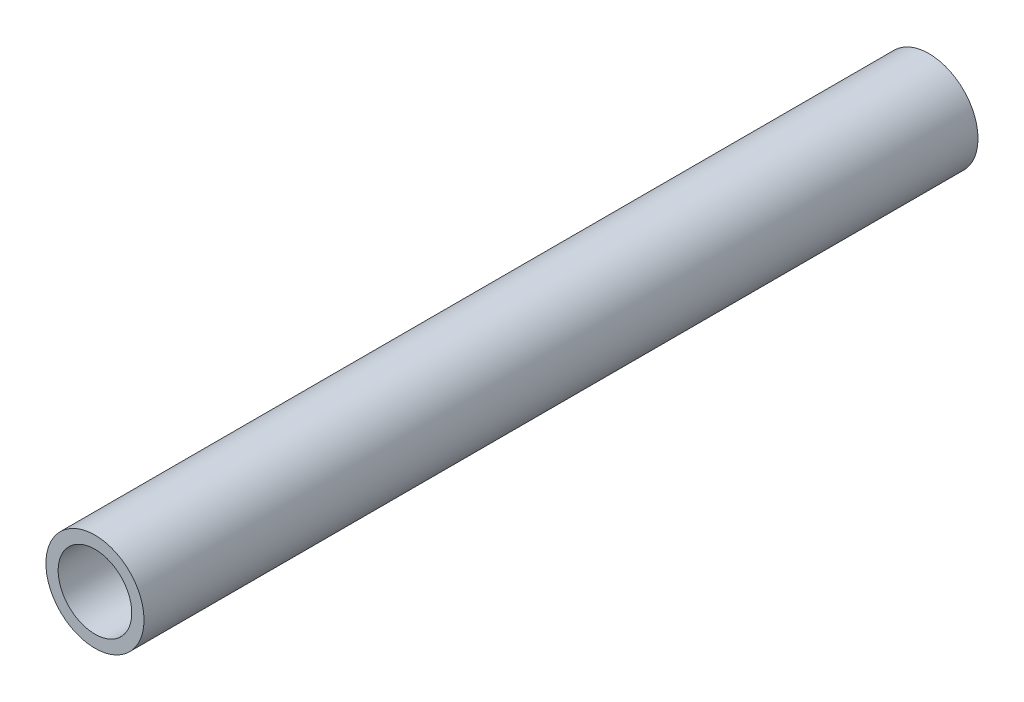
ISO-10303-21;
HEADER;
FILE_DESCRIPTION(('STEP AP214'),'2;1');
FILE_NAME('part.step','',(''),(''),'','','');
FILE_SCHEMA(('AUTOMOTIVE_DESIGN { 1 0 10303 214 1 1 1 1 }'));
ENDSEC;
DATA;
#1=APPLICATION_CONTEXT('core data for automotive mechanical design processes');
#2=APPLICATION_PROTOCOL_DEFINITION('international standard','automotive_design',2000,#1);
#3=PRODUCT_CONTEXT('',#1,'mechanical');
#4=PRODUCT('Part','Part','',(#3));
#5=PRODUCT_RELATED_PRODUCT_CATEGORY('part','',(#4));
#6=PRODUCT_DEFINITION_FORMATION('','',#4);
#7=PRODUCT_DEFINITION_CONTEXT('part definition',#1,'design');
#8=PRODUCT_DEFINITION('design','',#6,#7);
#9=PRODUCT_DEFINITION_SHAPE('','',#8);
#10=(LENGTH_UNIT() NAMED_UNIT(*) SI_UNIT(.MILLI.,.METRE.));
#11=(NAMED_UNIT(*) PLANE_ANGLE_UNIT() SI_UNIT($,.RADIAN.));
#12=(NAMED_UNIT(*) SI_UNIT($,.STERADIAN.) SOLID_ANGLE_UNIT());
#13=UNCERTAINTY_MEASURE_WITH_UNIT(LENGTH_MEASURE(1.E-05),#10,'distance_accuracy_value','');
#14=(GEOMETRIC_REPRESENTATION_CONTEXT(3) GLOBAL_UNCERTAINTY_ASSIGNED_CONTEXT((#13)) GLOBAL_UNIT_ASSIGNED_CONTEXT((#10,
#11,#12)) REPRESENTATION_CONTEXT('',''));
#15=CARTESIAN_POINT('',(0.,0.,0.));
#16=DIRECTION('',(0.,0.,1.));
#17=DIRECTION('',(1.,0.,0.));
#18=AXIS2_PLACEMENT_3D('',#15,#16,#17);
#19=CARTESIAN_POINT('',(0.,0.,215.9));
#20=DIRECTION('',(0.,0.,1.));
#21=DIRECTION('',(1.,0.,0.));
#22=AXIS2_PLACEMENT_3D('',#19,#20,#21);
#23=PLANE('',#22);
#24=CARTESIAN_POINT('',(0.,0.,215.9));
#25=DIRECTION('',(0.,0.,1.));
#26=DIRECTION('',(1.,0.,0.));
#27=AXIS2_PLACEMENT_3D('',#24,#25,#26);
#28=CIRCLE('',#27,12.7);
#29=CARTESIAN_POINT('',(12.7,0.,215.9));
#30=VERTEX_POINT('',#29);
#31=EDGE_CURVE('E10',#30,#30,#28,.T.);
#32=ORIENTED_EDGE('',*,*,#31,.T.);
#33=EDGE_LOOP('',(#32));
#34=FACE_BOUND('',#33,.T.);
#35=CARTESIAN_POINT('',(0.,0.,215.9));
#36=DIRECTION('',(0.,0.,1.));
#37=DIRECTION('',(1.,0.,0.));
#38=AXIS2_PLACEMENT_3D('',#35,#36,#37);
#39=CIRCLE('',#38,9.525);
#40=CARTESIAN_POINT('',(9.525,0.,215.9));
#41=VERTEX_POINT('',#40);
#42=EDGE_CURVE('E44',#41,#41,#39,.T.);
#43=ORIENTED_EDGE('',*,*,#42,.F.);
#44=EDGE_LOOP('',(#43));
#45=FACE_BOUND('',#44,.T.);
#46=ADVANCED_FACE('F33',(#34,#45),#23,.T.);
#47=CARTESIAN_POINT('',(0.,0.,0.));
#48=DIRECTION('',(0.,0.,1.));
#49=DIRECTION('',(1.,0.,0.));
#50=AXIS2_PLACEMENT_3D('',#47,#48,#49);
#51=PLANE('',#50);
#52=CARTESIAN_POINT('',(0.,0.,0.));
#53=DIRECTION('',(0.,0.,1.));
#54=DIRECTION('',(1.,0.,0.));
#55=AXIS2_PLACEMENT_3D('',#52,#53,#54);
#56=CIRCLE('',#55,12.7);
#57=CARTESIAN_POINT('',(12.7,0.,0.));
#58=VERTEX_POINT('',#57);
#59=EDGE_CURVE('E37',#58,#58,#56,.T.);
#60=ORIENTED_EDGE('',*,*,#59,.F.);
#61=EDGE_LOOP('',(#60));
#62=FACE_BOUND('',#61,.T.);
#63=CARTESIAN_POINT('',(0.,0.,0.));
#64=DIRECTION('',(0.,0.,1.));
#65=DIRECTION('',(1.,0.,0.));
#66=AXIS2_PLACEMENT_3D('',#63,#64,#65);
#67=CIRCLE('',#66,9.525);
#68=CARTESIAN_POINT('',(9.525,0.,0.));
#69=VERTEX_POINT('',#68);
#70=EDGE_CURVE('E46',#69,#69,#67,.T.);
#71=ORIENTED_EDGE('',*,*,#70,.T.);
#72=EDGE_LOOP('',(#71));
#73=FACE_BOUND('',#72,.T.);
#74=ADVANCED_FACE('F56',(#62,#73),#51,.F.);
#75=CARTESIAN_POINT('',(0.,0.,215.9));
#76=DIRECTION('',(0.,0.,-1.));
#77=DIRECTION('',(-1.,0.,0.));
#78=AXIS2_PLACEMENT_3D('',#75,#76,#77);
#79=CYLINDRICAL_SURFACE('',#78,12.7);
#80=ORIENTED_EDGE('',*,*,#31,.F.);
#81=EDGE_LOOP('',(#80));
#82=FACE_BOUND('',#81,.T.);
#83=ORIENTED_EDGE('',*,*,#59,.T.);
#84=EDGE_LOOP('',(#83));
#85=FACE_BOUND('',#84,.T.);
#86=ADVANCED_FACE('F35',(#82,#85),#79,.T.);
#87=CARTESIAN_POINT('',(0.,0.,215.9));
#88=DIRECTION('',(0.,0.,-1.));
#89=DIRECTION('',(-1.,0.,0.));
#90=AXIS2_PLACEMENT_3D('',#87,#88,#89);
#91=CYLINDRICAL_SURFACE('',#90,9.525);
#92=ORIENTED_EDGE('',*,*,#42,.T.);
#93=EDGE_LOOP('',(#92));
#94=FACE_BOUND('',#93,.T.);
#95=ORIENTED_EDGE('',*,*,#70,.F.);
#96=EDGE_LOOP('',(#95));
#97=FACE_BOUND('',#96,.T.);
#98=ADVANCED_FACE('F52',(#94,#97),#91,.F.);
#99=CLOSED_SHELL('',(#46,#74,#86,#98));
#100=MANIFOLD_SOLID_BREP('B2',#99);
#101=ADVANCED_BREP_SHAPE_REPRESENTATION('',(#18,#100),#14);
#102=SHAPE_DEFINITION_REPRESENTATION(#9,#101);
ENDSEC;
END-ISO-10303-21;
